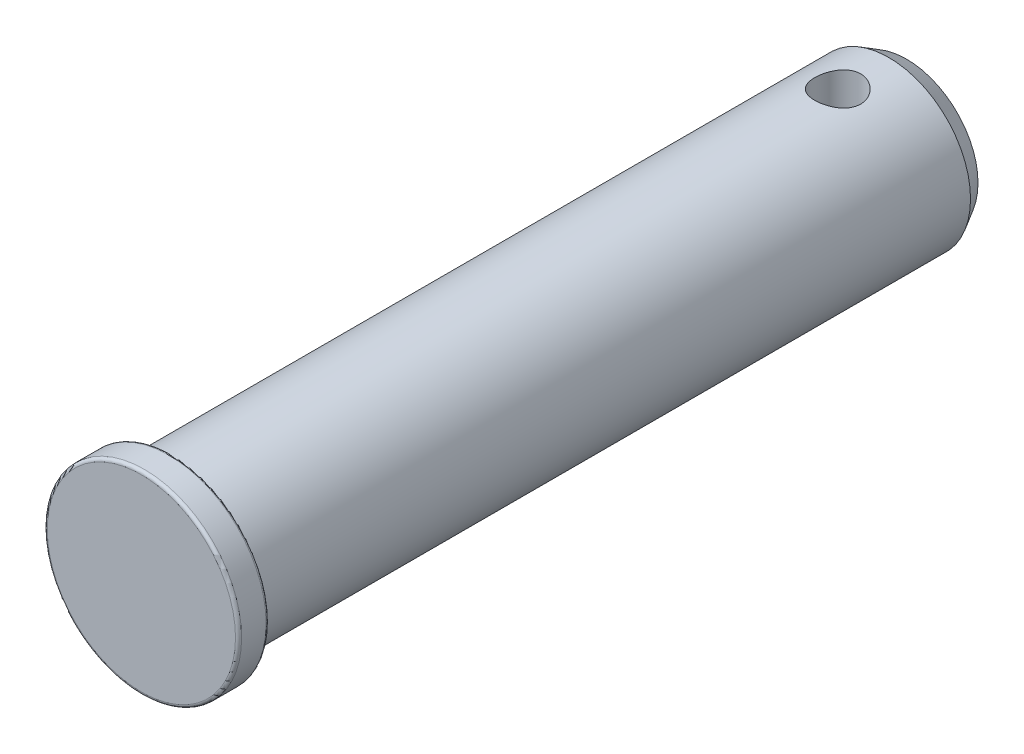
ISO-10303-21;
HEADER;
FILE_DESCRIPTION(('STEP AP214'),'2;1');
FILE_NAME('part.step','',(''),(''),'','','');
FILE_SCHEMA(('AUTOMOTIVE_DESIGN { 1 0 10303 214 1 1 1 1 }'));
ENDSEC;
DATA;
#1=APPLICATION_CONTEXT('core data for automotive mechanical design processes');
#2=APPLICATION_PROTOCOL_DEFINITION('international standard','automotive_design',2000,#1);
#3=PRODUCT_CONTEXT('',#1,'mechanical');
#4=PRODUCT('Part','Part','',(#3));
#5=PRODUCT_RELATED_PRODUCT_CATEGORY('part','',(#4));
#6=PRODUCT_DEFINITION_FORMATION('','',#4);
#7=PRODUCT_DEFINITION_CONTEXT('part definition',#1,'design');
#8=PRODUCT_DEFINITION('design','',#6,#7);
#9=PRODUCT_DEFINITION_SHAPE('','',#8);
#10=(LENGTH_UNIT() NAMED_UNIT(*) SI_UNIT(.MILLI.,.METRE.));
#11=(NAMED_UNIT(*) PLANE_ANGLE_UNIT() SI_UNIT($,.RADIAN.));
#12=(NAMED_UNIT(*) SI_UNIT($,.STERADIAN.) SOLID_ANGLE_UNIT());
#13=UNCERTAINTY_MEASURE_WITH_UNIT(LENGTH_MEASURE(1.E-05),#10,'distance_accuracy_value','');
#14=(GEOMETRIC_REPRESENTATION_CONTEXT(3) GLOBAL_UNCERTAINTY_ASSIGNED_CONTEXT((#13)) GLOBAL_UNIT_ASSIGNED_CONTEXT((#10,
#11,#12)) REPRESENTATION_CONTEXT('',''));
#15=CARTESIAN_POINT('',(0.,0.,0.));
#16=DIRECTION('',(0.,0.,1.));
#17=DIRECTION('',(1.,0.,0.));
#18=AXIS2_PLACEMENT_3D('',#15,#16,#17);
#19=CARTESIAN_POINT('',(0.,0.,0.));
#20=DIRECTION('',(0.,0.,-1.));
#21=DIRECTION('',(-1.,0.,0.));
#22=AXIS2_PLACEMENT_3D('',#19,#20,#21);
#23=PLANE('',#22);
#24=CARTESIAN_POINT('',(0.,0.,0.));
#25=DIRECTION('',(0.,0.,-1.));
#26=DIRECTION('',(-1.,0.,0.));
#27=AXIS2_PLACEMENT_3D('',#24,#25,#26);
#28=CIRCLE('',#27,9.225);
#29=CARTESIAN_POINT('',(-9.225,0.,0.));
#30=VERTEX_POINT('',#29);
#31=EDGE_CURVE('E10',#30,#30,#28,.F.);
#32=ORIENTED_EDGE('',*,*,#31,.T.);
#33=EDGE_LOOP('',(#32));
#34=FACE_BOUND('',#33,.T.);
#35=ADVANCED_FACE('F33',(#34),#23,.F.);
#36=CARTESIAN_POINT('',(0.,0.,0.));
#37=DIRECTION('',(0.,0.,1.));
#38=DIRECTION('',(1.,0.,0.));
#39=AXIS2_PLACEMENT_3D('',#36,#37,#38);
#40=CYLINDRICAL_SURFACE('',#39,9.525);
#41=CARTESIAN_POINT('',(0.,0.,-2.7));
#42=DIRECTION('',(0.,0.,1.));
#43=DIRECTION('',(1.,0.,0.));
#44=AXIS2_PLACEMENT_3D('',#41,#42,#43);
#45=CIRCLE('',#44,9.525);
#46=CARTESIAN_POINT('',(9.525,0.,-2.7));
#47=VERTEX_POINT('',#46);
#48=EDGE_CURVE('E44',#47,#47,#45,.T.);
#49=ORIENTED_EDGE('',*,*,#48,.T.);
#50=EDGE_LOOP('',(#49));
#51=FACE_BOUND('',#50,.T.);
#52=CARTESIAN_POINT('',(0.,0.,-0.3));
#53=DIRECTION('',(0.,0.,-1.));
#54=DIRECTION('',(-1.,0.,0.));
#55=AXIS2_PLACEMENT_3D('',#52,#53,#54);
#56=CIRCLE('',#55,9.525);
#57=CARTESIAN_POINT('',(-9.525,0.,-0.3));
#58=VERTEX_POINT('',#57);
#59=EDGE_CURVE('E48',#58,#58,#56,.T.);
#60=ORIENTED_EDGE('',*,*,#59,.T.);
#61=EDGE_LOOP('',(#60));
#62=FACE_BOUND('',#61,.T.);
#63=ADVANCED_FACE('F94',(#51,#62),#40,.T.);
#64=CARTESIAN_POINT('',(0.,9.525,-3.));
#65=DIRECTION('',(0.,0.,1.));
#66=DIRECTION('',(1.,0.,0.));
#67=AXIS2_PLACEMENT_3D('',#64,#65,#66);
#68=PLANE('',#67);
#69=CARTESIAN_POINT('',(0.,0.,-3.));
#70=DIRECTION('',(0.,0.,1.));
#71=DIRECTION('',(1.,0.,0.));
#72=AXIS2_PLACEMENT_3D('',#69,#70,#71);
#73=CIRCLE('',#72,9.225);
#74=CARTESIAN_POINT('',(9.225,0.,-3.));
#75=VERTEX_POINT('',#74);
#76=EDGE_CURVE('E40',#75,#75,#73,.F.);
#77=ORIENTED_EDGE('',*,*,#76,.T.);
#78=EDGE_LOOP('',(#77));
#79=FACE_BOUND('',#78,.T.);
#80=CARTESIAN_POINT('',(0.,0.,-3.));
#81=DIRECTION('',(0.,0.,1.));
#82=DIRECTION('',(1.,0.,0.));
#83=AXIS2_PLACEMENT_3D('',#80,#81,#82);
#84=CIRCLE('',#83,8.30000000000002);
#85=CARTESIAN_POINT('',(8.30000000000002,0.,-3.));
#86=VERTEX_POINT('',#85);
#87=EDGE_CURVE('E62',#86,#86,#84,.T.);
#88=ORIENTED_EDGE('',*,*,#87,.T.);
#89=EDGE_LOOP('',(#88));
#90=FACE_BOUND('',#89,.T.);
#91=ADVANCED_FACE('F91',(#79,#90),#68,.F.);
#92=CARTESIAN_POINT('',(0.,0.,0.));
#93=DIRECTION('',(0.,0.,1.));
#94=DIRECTION('',(1.,0.,0.));
#95=AXIS2_PLACEMENT_3D('',#92,#93,#94);
#96=CYLINDRICAL_SURFACE('',#95,8.00000000000002);
#97=CARTESIAN_POINT('',(0.,0.,-73.2679491924312));
#98=DIRECTION('',(0.,0.,1.));
#99=DIRECTION('',(1.,0.,0.));
#100=AXIS2_PLACEMENT_3D('',#97,#98,#99);
#101=CIRCLE('',#100,8.00000000000002);
#102=CARTESIAN_POINT('',(8.00000000000002,0.,-73.2679491924312));
#103=VERTEX_POINT('',#102);
#104=EDGE_CURVE('E56',#103,#103,#101,.T.);
#105=ORIENTED_EDGE('',*,*,#104,.T.);
#106=EDGE_LOOP('',(#105));
#107=FACE_BOUND('',#106,.T.);
#108=CARTESIAN_POINT('',(0.,0.,-3.3));
#109=DIRECTION('',(0.,0.,1.));
#110=DIRECTION('',(1.,0.,0.));
#111=AXIS2_PLACEMENT_3D('',#108,#109,#110);
#112=CIRCLE('',#111,8.00000000000002);
#113=CARTESIAN_POINT('',(8.00000000000002,0.,-3.3));
#114=VERTEX_POINT('',#113);
#115=EDGE_CURVE('E59',#114,#114,#112,.F.);
#116=ORIENTED_EDGE('',*,*,#115,.T.);
#117=EDGE_LOOP('',(#116));
#118=FACE_BOUND('',#117,.T.);
#119=CARTESIAN_POINT('',(0.,-8.00000000000002,-66.));
#120=CARTESIAN_POINT('',(0.123780136226796,-7.9999984218713,-66.0000023753347));
#121=CARTESIAN_POINT('',(0.247584907831841,-7.99709927975131,-66.0102484504468));
#122=CARTESIAN_POINT('',(0.491611373397504,-7.98581625144003,-66.0508790725337));
#123=CARTESIAN_POINT('',(0.611831603090776,-7.97743015509971,-66.0812717346329));
#124=CARTESIAN_POINT('',(0.845132540047842,-7.95609599210555,-66.1611167859934));
#125=CARTESIAN_POINT('',(0.958222777735985,-7.94315417420686,-66.2105430768786));
#126=CARTESIAN_POINT('',(1.17450981060239,-7.91406663243916,-66.3269511871063));
#127=CARTESIAN_POINT('',(1.27770565752828,-7.89792060194115,-66.3939346867931));
#128=CARTESIAN_POINT('',(1.47391114059969,-7.86369767273315,-66.5453613235248));
#129=CARTESIAN_POINT('',(1.56663205824822,-7.84558491763585,-66.6301704487428));
#130=CARTESIAN_POINT('',(1.73674045164915,-7.80969310823848,-66.8140595890771));
#131=CARTESIAN_POINT('',(1.81412570935586,-7.7919141025458,-66.9131416649624));
#132=CARTESIAN_POINT('',(1.95282069316972,-7.7583308250619,-67.1251271335197));
#133=CARTESIAN_POINT('',(2.01378972318443,-7.74257151336372,-67.2382612154595));
#134=CARTESIAN_POINT('',(2.11572381813797,-7.71534289740213,-67.4736901510647));
#135=CARTESIAN_POINT('',(2.15669303705113,-7.70387270240219,-67.5959830963366));
#136=CARTESIAN_POINT('',(2.21644550121995,-7.68689269299954,-67.8430411026234));
#137=CARTESIAN_POINT('',(2.2357560484979,-7.68124150383162,-67.9676686692201));
#138=CARTESIAN_POINT('',(2.25328816095872,-7.67611771194811,-68.2185127710376));
#139=CARTESIAN_POINT('',(2.25151415202464,-7.67664381255035,-68.3447289672309));
#140=CARTESIAN_POINT('',(2.22734423131721,-7.68368914397773,-68.590980362275));
#141=CARTESIAN_POINT('',(2.20559571333702,-7.69002021911336,-68.7110853578021));
#142=CARTESIAN_POINT('',(2.14313486827327,-7.7076595528475,-68.9458685432922));
#143=CARTESIAN_POINT('',(2.10242087445025,-7.71896824888856,-69.0605462553142));
#144=CARTESIAN_POINT('',(2.00267907192455,-7.74544750058613,-69.2828627435808));
#145=CARTESIAN_POINT('',(1.94343157951607,-7.76066396698543,-69.3903972588968));
#146=CARTESIAN_POINT('',(1.80845757464119,-7.79322068518713,-69.594220976937));
#147=CARTESIAN_POINT('',(1.73272749416113,-7.81056139647253,-69.6905077378948));
#148=CARTESIAN_POINT('',(1.56366800478981,-7.84618747121738,-69.8727905298095));
#149=CARTESIAN_POINT('',(1.46979757357977,-7.86448422457827,-69.9582833333352));
#150=CARTESIAN_POINT('',(1.26882591772857,-7.89939668632424,-70.1124226714874));
#151=CARTESIAN_POINT('',(1.16172404941148,-7.91601231285516,-70.1810683860601));
#152=CARTESIAN_POINT('',(0.936493342648714,-7.94581242298408,-70.2998214854276));
#153=CARTESIAN_POINT('',(0.818309290352512,-7.95897833521146,-70.349829118339));
#154=CARTESIAN_POINT('',(0.574754739241739,-7.98026169134056,-70.4291161505425));
#155=CARTESIAN_POINT('',(0.449386001714236,-7.98838036681222,-70.4584006067125));
#156=CARTESIAN_POINT('',(0.199308367677802,-7.99846459601902,-70.4945997529099));
#157=CARTESIAN_POINT('',(0.0747057939807256,-8.00061801539682,-70.5021976660607));
#158=CARTESIAN_POINT('',(-0.173996342344965,-7.99907390001738,-70.4967067992348));
#159=CARTESIAN_POINT('',(-0.298095961627189,-7.99537704370712,-70.4836204179824));
#160=CARTESIAN_POINT('',(-0.539771482113887,-7.98266987007643,-70.4376897649959));
#161=CARTESIAN_POINT('',(-0.657427283699726,-7.97376417367827,-70.4052342727607));
#162=CARTESIAN_POINT('',(-0.885607078707537,-7.95165716960976,-70.3219450418131));
#163=CARTESIAN_POINT('',(-0.996130256988531,-7.93845537200411,-70.2711092068989));
#164=CARTESIAN_POINT('',(-1.20950279554107,-7.90879007934738,-70.1512866767091));
#165=CARTESIAN_POINT('',(-1.31214014467196,-7.89226344568533,-70.0819384805048));
#166=CARTESIAN_POINT('',(-1.50455798960205,-7.85785438337427,-69.9275075759568));
#167=CARTESIAN_POINT('',(-1.59433564471719,-7.8399716564968,-69.8424214006027));
#168=CARTESIAN_POINT('',(-1.76142096314827,-7.80416160393674,-69.6557301205214));
#169=CARTESIAN_POINT('',(-1.83824454709431,-7.78625074860465,-69.5536877484536));
#170=CARTESIAN_POINT('',(-1.97369813128562,-7.75302507175319,-69.3377747783249));
#171=CARTESIAN_POINT('',(-2.03232880180365,-7.73771015460236,-69.2239046162361));
#172=CARTESIAN_POINT('',(-2.12929950951798,-7.71158917229138,-68.9880680327185));
#173=CARTESIAN_POINT('',(-2.16775011069943,-7.70075860843759,-68.8661499371963));
#174=CARTESIAN_POINT('',(-2.22349012424077,-7.68485185034714,-68.6172163246741));
#175=CARTESIAN_POINT('',(-2.2407857018427,-7.67977397962586,-68.4902023039376));
#176=CARTESIAN_POINT('',(-2.25334169418253,-7.6760984911805,-68.2396681184866));
#177=CARTESIAN_POINT('',(-2.24938460541638,-7.67727074007366,-68.1161899920559));
#178=CARTESIAN_POINT('',(-2.2213850908605,-7.68541842306242,-67.8717374321326));
#179=CARTESIAN_POINT('',(-2.19734329687039,-7.69239367461437,-67.7507629200071));
#180=CARTESIAN_POINT('',(-2.13033324239049,-7.71121681688847,-67.5158608041036));
#181=CARTESIAN_POINT('',(-2.08754834058224,-7.72301742974189,-67.4018768334002));
#182=CARTESIAN_POINT('',(-1.98440836173859,-7.75015834714454,-67.1826157621296));
#183=CARTESIAN_POINT('',(-1.92405025656108,-7.76549926164942,-67.0773401661718));
#184=CARTESIAN_POINT('',(-1.785179949076,-7.79861380514405,-66.8747927603876));
#185=CARTESIAN_POINT('',(-1.70614225848473,-7.81645021615241,-66.7778914716444));
#186=CARTESIAN_POINT('',(-1.53313294180605,-7.85221584609082,-66.5984734378353));
#187=CARTESIAN_POINT('',(-1.43915759379494,-7.87014508707079,-66.5159602885464));
#188=CARTESIAN_POINT('',(-1.23615231046758,-7.90460443408532,-66.3656524734331));
#189=CARTESIAN_POINT('',(-1.12680885741896,-7.92108926149719,-66.2982698969854));
#190=CARTESIAN_POINT('',(-0.897882751335928,-7.95028824463797,-66.1829462186234));
#191=CARTESIAN_POINT('',(-0.778305978948954,-7.96300454747146,-66.1349940405605));
#192=CARTESIAN_POINT('',(-0.549510786908442,-7.9818125535358,-66.0653292082553));
#193=CARTESIAN_POINT('',(-0.441170382357758,-7.98858039163815,-66.0408915352095));
#194=CARTESIAN_POINT('',(-0.221893033303146,-7.99767454528479,-66.0082268770984));
#195=CARTESIAN_POINT('',(-0.110956414302969,-8.00000141463334,-65.9999978707518));
#196=CARTESIAN_POINT('',(0.,-8.00000000000002,-66.));
#197=B_SPLINE_CURVE_WITH_KNOTS('',3,(#119,#120,#121,#122,#123,#124,#125,#126,#127,#128,#129,
#130,#131,#132,#133,#134,#135,#136,#137,#138,#139,#140,#141,#142,#143,#144,#145,#146,#147,#148,
#149,#150,#151,#152,#153,#154,#155,#156,#157,#158,#159,#160,#161,#162,#163,#164,#165,#166,#167,
#168,#169,#170,#171,#172,#173,#174,#175,#176,#177,#178,#179,#180,#181,#182,#183,#184,#185,#186,
#187,#188,#189,#190,#191,#192,#193,#194,#195,#196),.UNSPECIFIED.,.T.,.F.,(4,2,2,2,2,2,2,2,2,2,2,
2,2,2,2,2,2,2,2,2,2,2,2,2,2,2,2,2,2,2,2,2,2,2,2,2,2,2,4),(0.,0.370933225325728,
0.742015954875254,1.1125916676049,1.48320285991023,1.86233426372983,2.24152046258442,
2.62805703120609,3.01451328172578,3.39134154209224,3.76809070340941,4.1330441587503,
4.49802969328198,4.86751685045548,5.23708407082972,5.62012636061608,6.00318729178401,
6.38826990510994,6.77325851798923,7.14597673997028,7.51865174159088,7.8840867114581,
8.24956337081549,8.62277786221355,8.99607466932331,9.38117545756861,9.76626205604603,
10.1492161894789,10.5320586913703,10.900904309342,11.2697383250649,11.6350420183846,
12.000408696627,12.3776301138441,12.7549456687473,13.1415448143547,13.5279232710186,
13.8604689874155,14.1929732314936),.UNSPECIFIED.);
#198=CARTESIAN_POINT('',(0.,-8.00000000000002,-66.));
#199=VERTEX_POINT('',#198);
#200=EDGE_CURVE('E65',#199,#199,#197,.T.);
#201=ORIENTED_EDGE('',*,*,#200,.T.);
#202=EDGE_LOOP('',(#201));
#203=FACE_BOUND('',#202,.T.);
#204=CARTESIAN_POINT('',(0.,8.00000000000002,-66.));
#205=CARTESIAN_POINT('',(-0.123780136226796,7.99999842187129,-66.0000023753347));
#206=CARTESIAN_POINT('',(-0.247584907831841,7.99709927975131,-66.0102484504468));
#207=CARTESIAN_POINT('',(-0.491611373397505,7.98581625144003,-66.0508790725337));
#208=CARTESIAN_POINT('',(-0.611831603090777,7.97743015509971,-66.0812717346329));
#209=CARTESIAN_POINT('',(-0.845132540047843,7.95609599210555,-66.1611167859934));
#210=CARTESIAN_POINT('',(-0.958222777735985,7.94315417420686,-66.2105430768786));
#211=CARTESIAN_POINT('',(-1.17450981060239,7.91406663243916,-66.3269511871063));
#212=CARTESIAN_POINT('',(-1.27770565752828,7.89792060194115,-66.3939346867931));
#213=CARTESIAN_POINT('',(-1.47391114059969,7.86369767273315,-66.5453613235248));
#214=CARTESIAN_POINT('',(-1.56663205824822,7.84558491763585,-66.6301704487428));
#215=CARTESIAN_POINT('',(-1.73674045164915,7.80969310823848,-66.8140595890771));
#216=CARTESIAN_POINT('',(-1.81412570935586,7.7919141025458,-66.9131416649624));
#217=CARTESIAN_POINT('',(-1.95282069316972,7.7583308250619,-67.1251271335197));
#218=CARTESIAN_POINT('',(-2.01378972318443,7.74257151336372,-67.2382612154595));
#219=CARTESIAN_POINT('',(-2.11572381813797,7.71534289740213,-67.4736901510647));
#220=CARTESIAN_POINT('',(-2.15669303705113,7.70387270240219,-67.5959830963366));
#221=CARTESIAN_POINT('',(-2.21644550121995,7.68689269299954,-67.8430411026234));
#222=CARTESIAN_POINT('',(-2.2357560484979,7.68124150383162,-67.9676686692201));
#223=CARTESIAN_POINT('',(-2.25328816095872,7.67611771194811,-68.2185127710376));
#224=CARTESIAN_POINT('',(-2.25151415202464,7.67664381255035,-68.3447289672309));
#225=CARTESIAN_POINT('',(-2.22734423131721,7.68368914397773,-68.590980362275));
#226=CARTESIAN_POINT('',(-2.20559571333702,7.69002021911336,-68.7110853578021));
#227=CARTESIAN_POINT('',(-2.14313486827327,7.7076595528475,-68.9458685432922));
#228=CARTESIAN_POINT('',(-2.10242087445025,7.71896824888856,-69.0605462553142));
#229=CARTESIAN_POINT('',(-2.00267907192455,7.74544750058613,-69.2828627435808));
#230=CARTESIAN_POINT('',(-1.94343157951607,7.76066396698543,-69.3903972588968));
#231=CARTESIAN_POINT('',(-1.80845757464119,7.79322068518713,-69.594220976937));
#232=CARTESIAN_POINT('',(-1.73272749416113,7.81056139647253,-69.6905077378948));
#233=CARTESIAN_POINT('',(-1.56366800478981,7.84618747121738,-69.8727905298095));
#234=CARTESIAN_POINT('',(-1.46979757357977,7.86448422457827,-69.9582833333352));
#235=CARTESIAN_POINT('',(-1.26882591772857,7.89939668632424,-70.1124226714874));
#236=CARTESIAN_POINT('',(-1.16172404941148,7.91601231285516,-70.1810683860601));
#237=CARTESIAN_POINT('',(-0.936493342648715,7.94581242298408,-70.2998214854276));
#238=CARTESIAN_POINT('',(-0.818309290352513,7.95897833521146,-70.349829118339));
#239=CARTESIAN_POINT('',(-0.57475473924174,7.98026169134056,-70.4291161505425));
#240=CARTESIAN_POINT('',(-0.449386001714237,7.98838036681222,-70.4584006067125));
#241=CARTESIAN_POINT('',(-0.199308367677803,7.99846459601902,-70.4945997529099));
#242=CARTESIAN_POINT('',(-0.0747057939807263,8.00061801539682,-70.5021976660607));
#243=CARTESIAN_POINT('',(0.173996342344964,7.99907390001738,-70.4967067992348));
#244=CARTESIAN_POINT('',(0.298095961627188,7.99537704370712,-70.4836204179824));
#245=CARTESIAN_POINT('',(0.539771482113887,7.98266987007643,-70.4376897649959));
#246=CARTESIAN_POINT('',(0.657427283699726,7.97376417367827,-70.4052342727607));
#247=CARTESIAN_POINT('',(0.885607078707537,7.95165716960976,-70.3219450418131));
#248=CARTESIAN_POINT('',(0.996130256988531,7.93845537200411,-70.2711092068989));
#249=CARTESIAN_POINT('',(1.20950279554107,7.90879007934738,-70.1512866767091));
#250=CARTESIAN_POINT('',(1.31214014467196,7.89226344568533,-70.0819384805048));
#251=CARTESIAN_POINT('',(1.50455798960205,7.85785438337427,-69.9275075759568));
#252=CARTESIAN_POINT('',(1.59433564471719,7.8399716564968,-69.8424214006027));
#253=CARTESIAN_POINT('',(1.76142096314827,7.80416160393674,-69.6557301205214));
#254=CARTESIAN_POINT('',(1.83824454709431,7.78625074860465,-69.5536877484536));
#255=CARTESIAN_POINT('',(1.97369813128562,7.75302507175319,-69.3377747783249));
#256=CARTESIAN_POINT('',(2.03232880180365,7.73771015460236,-69.2239046162361));
#257=CARTESIAN_POINT('',(2.12929950951798,7.71158917229138,-68.9880680327185));
#258=CARTESIAN_POINT('',(2.16775011069943,7.70075860843759,-68.8661499371963));
#259=CARTESIAN_POINT('',(2.22349012424077,7.68485185034714,-68.6172163246741));
#260=CARTESIAN_POINT('',(2.2407857018427,7.67977397962586,-68.4902023039376));
#261=CARTESIAN_POINT('',(2.25334169418253,7.6760984911805,-68.2396681184866));
#262=CARTESIAN_POINT('',(2.24938460541638,7.67727074007366,-68.1161899920559));
#263=CARTESIAN_POINT('',(2.2213850908605,7.68541842306242,-67.8717374321326));
#264=CARTESIAN_POINT('',(2.19734329687039,7.69239367461437,-67.7507629200071));
#265=CARTESIAN_POINT('',(2.13033324239049,7.71121681688847,-67.5158608041036));
#266=CARTESIAN_POINT('',(2.08754834058224,7.72301742974189,-67.4018768334002));
#267=CARTESIAN_POINT('',(1.98440836173859,7.75015834714454,-67.1826157621296));
#268=CARTESIAN_POINT('',(1.92405025656108,7.76549926164942,-67.0773401661718));
#269=CARTESIAN_POINT('',(1.785179949076,7.79861380514405,-66.8747927603876));
#270=CARTESIAN_POINT('',(1.70614225848473,7.81645021615241,-66.7778914716444));
#271=CARTESIAN_POINT('',(1.53313294180605,7.85221584609082,-66.5984734378353));
#272=CARTESIAN_POINT('',(1.43915759379494,7.87014508707079,-66.5159602885464));
#273=CARTESIAN_POINT('',(1.23615231046758,7.90460443408532,-66.3656524734331));
#274=CARTESIAN_POINT('',(1.12680885741896,7.92108926149719,-66.2982698969854));
#275=CARTESIAN_POINT('',(0.897882751335932,7.95028824463797,-66.1829462186234));
#276=CARTESIAN_POINT('',(0.778305978948959,7.96300454747146,-66.1349940405605));
#277=CARTESIAN_POINT('',(0.549510786908447,7.9818125535358,-66.0653292082553));
#278=CARTESIAN_POINT('',(0.441170382357762,7.98858039163815,-66.0408915352095));
#279=CARTESIAN_POINT('',(0.221893033303148,7.99767454528479,-66.0082268770984));
#280=CARTESIAN_POINT('',(0.11095641430297,8.00000141463334,-65.9999978707518));
#281=CARTESIAN_POINT('',(0.,8.00000000000002,-66.));
#282=B_SPLINE_CURVE_WITH_KNOTS('',3,(#204,#205,#206,#207,#208,#209,#210,#211,#212,#213,#214,
#215,#216,#217,#218,#219,#220,#221,#222,#223,#224,#225,#226,#227,#228,#229,#230,#231,#232,#233,
#234,#235,#236,#237,#238,#239,#240,#241,#242,#243,#244,#245,#246,#247,#248,#249,#250,#251,#252,
#253,#254,#255,#256,#257,#258,#259,#260,#261,#262,#263,#264,#265,#266,#267,#268,#269,#270,#271,
#272,#273,#274,#275,#276,#277,#278,#279,#280,#281),.UNSPECIFIED.,.T.,.F.,(4,2,2,2,2,2,2,2,2,2,2,
2,2,2,2,2,2,2,2,2,2,2,2,2,2,2,2,2,2,2,2,2,2,2,2,2,2,2,4),(0.,0.370933225325728,
0.742015954875255,1.1125916676049,1.48320285991023,1.86233426372983,2.24152046258442,
2.62805703120609,3.01451328172578,3.39134154209224,3.76809070340941,4.1330441587503,
4.49802969328198,4.86751685045548,5.23708407082972,5.62012636061608,6.00318729178401,
6.38826990510994,6.77325851798923,7.14597673997028,7.51865174159088,7.8840867114581,
8.24956337081549,8.62277786221355,8.99607466932331,9.38117545756861,9.76626205604603,
10.1492161894789,10.5320586913703,10.900904309342,11.2697383250649,11.6350420183846,
12.000408696627,12.3776301138441,12.7549456687473,13.1415448143547,13.5279232710186,
13.8604689874155,14.1929732314936),.UNSPECIFIED.);
#283=CARTESIAN_POINT('',(0.,8.00000000000002,-66.));
#284=VERTEX_POINT('',#283);
#285=EDGE_CURVE('E72',#284,#284,#282,.T.);
#286=ORIENTED_EDGE('',*,*,#285,.T.);
#287=EDGE_LOOP('',(#286));
#288=FACE_BOUND('',#287,.T.);
#289=ADVANCED_FACE('F75',(#107,#118,#203,#288),#96,.T.);
#290=CARTESIAN_POINT('',(0.,8.00000000000004,-75.));
#291=DIRECTION('',(0.,0.,1.));
#292=DIRECTION('',(1.,0.,0.));
#293=AXIS2_PLACEMENT_3D('',#290,#291,#292);
#294=PLANE('',#293);
#295=CARTESIAN_POINT('',(0.,0.,-75.));
#296=DIRECTION('',(0.,0.,1.));
#297=DIRECTION('',(1.,0.,0.));
#298=AXIS2_PLACEMENT_3D('',#295,#296,#297);
#299=CIRCLE('',#298,7.00000000000005);
#300=CARTESIAN_POINT('',(7.00000000000005,0.,-75.));
#301=VERTEX_POINT('',#300);
#302=EDGE_CURVE('E53',#301,#301,#299,.F.);
#303=ORIENTED_EDGE('',*,*,#302,.T.);
#304=EDGE_LOOP('',(#303));
#305=FACE_BOUND('',#304,.T.);
#306=ADVANCED_FACE('F83',(#305),#294,.F.);
#307=CARTESIAN_POINT('',(0.,-9.525,-68.25));
#308=DIRECTION('',(0.,1.,0.));
#309=DIRECTION('',(0.,0.,1.));
#310=AXIS2_PLACEMENT_3D('',#307,#308,#309);
#311=CYLINDRICAL_SURFACE('',#310,2.25);
#312=ORIENTED_EDGE('',*,*,#285,.F.);
#313=EDGE_LOOP('',(#312));
#314=FACE_BOUND('',#313,.T.);
#315=ORIENTED_EDGE('',*,*,#200,.F.);
#316=EDGE_LOOP('',(#315));
#317=FACE_BOUND('',#316,.T.);
#318=ADVANCED_FACE('F79',(#314,#317),#311,.F.);
#319=CARTESIAN_POINT('',(0.,0.,-3.3));
#320=DIRECTION('',(0.,0.,1.));
#321=DIRECTION('',(1.,0.,0.));
#322=AXIS2_PLACEMENT_3D('',#319,#320,#321);
#323=TOROIDAL_SURFACE('',#322,8.30000000000002,0.3);
#324=ORIENTED_EDGE('',*,*,#115,.F.);
#325=EDGE_LOOP('',(#324));
#326=FACE_BOUND('',#325,.T.);
#327=ORIENTED_EDGE('',*,*,#87,.F.);
#328=EDGE_LOOP('',(#327));
#329=FACE_BOUND('',#328,.T.);
#330=ADVANCED_FACE('F82',(#326,#329),#323,.F.);
#331=CARTESIAN_POINT('',(0.,0.,-73.2679491924312));
#332=DIRECTION('',(0.,0.,1.));
#333=DIRECTION('',(1.,0.,0.));
#334=AXIS2_PLACEMENT_3D('',#331,#332,#333);
#335=CONICAL_SURFACE('',#334,8.00000000000002,0.5235987755983);
#336=ORIENTED_EDGE('',*,*,#302,.F.);
#337=EDGE_LOOP('',(#336));
#338=FACE_BOUND('',#337,.T.);
#339=ORIENTED_EDGE('',*,*,#104,.F.);
#340=EDGE_LOOP('',(#339));
#341=FACE_BOUND('',#340,.T.);
#342=ADVANCED_FACE('F104',(#338,#341),#335,.T.);
#343=CARTESIAN_POINT('',(0.,0.,-2.7));
#344=DIRECTION('',(0.,0.,1.));
#345=DIRECTION('',(1.,0.,0.));
#346=AXIS2_PLACEMENT_3D('',#343,#344,#345);
#347=TOROIDAL_SURFACE('',#346,9.225,0.3);
#348=ORIENTED_EDGE('',*,*,#76,.F.);
#349=EDGE_LOOP('',(#348));
#350=FACE_BOUND('',#349,.T.);
#351=ORIENTED_EDGE('',*,*,#48,.F.);
#352=EDGE_LOOP('',(#351));
#353=FACE_BOUND('',#352,.T.);
#354=ADVANCED_FACE('F107',(#350,#353),#347,.T.);
#355=CARTESIAN_POINT('',(0.,0.,-0.3));
#356=DIRECTION('',(0.,0.,-1.));
#357=DIRECTION('',(-1.,0.,0.));
#358=AXIS2_PLACEMENT_3D('',#355,#356,#357);
#359=TOROIDAL_SURFACE('',#358,9.225,0.3);
#360=ORIENTED_EDGE('',*,*,#59,.F.);
#361=EDGE_LOOP('',(#360));
#362=FACE_BOUND('',#361,.T.);
#363=ORIENTED_EDGE('',*,*,#31,.F.);
#364=EDGE_LOOP('',(#363));
#365=FACE_BOUND('',#364,.T.);
#366=ADVANCED_FACE('F35',(#362,#365),#359,.T.);
#367=CLOSED_SHELL('',(#35,#63,#91,#289,#306,#318,#330,#342,#354,#366));
#368=MANIFOLD_SOLID_BREP('B2',#367);
#369=ADVANCED_BREP_SHAPE_REPRESENTATION('',(#18,#368),#14);
#370=SHAPE_DEFINITION_REPRESENTATION(#9,#369);
ENDSEC;
END-ISO-10303-21;
